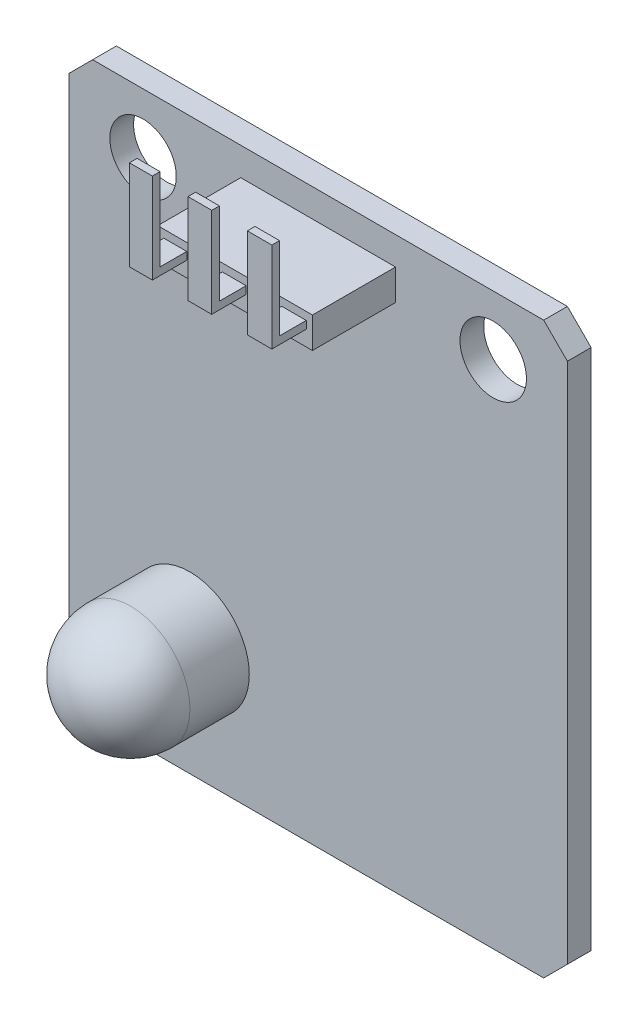
ISO-10303-21;
HEADER;
FILE_DESCRIPTION(('STEP AP214'),'2;1');
FILE_NAME('part.step','',(''),(''),'','','');
FILE_SCHEMA(('AUTOMOTIVE_DESIGN { 1 0 10303 214 1 1 1 1 }'));
ENDSEC;
DATA;
#1=APPLICATION_CONTEXT('core data for automotive mechanical design processes');
#2=APPLICATION_PROTOCOL_DEFINITION('international standard','automotive_design',2000,#1);
#3=PRODUCT_CONTEXT('',#1,'mechanical');
#4=PRODUCT('Part','Part','',(#3));
#5=PRODUCT_RELATED_PRODUCT_CATEGORY('part','',(#4));
#6=PRODUCT_DEFINITION_FORMATION('','',#4);
#7=PRODUCT_DEFINITION_CONTEXT('part definition',#1,'design');
#8=PRODUCT_DEFINITION('design','',#6,#7);
#9=PRODUCT_DEFINITION_SHAPE('','',#8);
#10=(LENGTH_UNIT() NAMED_UNIT(*) SI_UNIT(.MILLI.,.METRE.));
#11=(NAMED_UNIT(*) PLANE_ANGLE_UNIT() SI_UNIT($,.RADIAN.));
#12=(NAMED_UNIT(*) SI_UNIT($,.STERADIAN.) SOLID_ANGLE_UNIT());
#13=UNCERTAINTY_MEASURE_WITH_UNIT(LENGTH_MEASURE(1.E-05),#10,'distance_accuracy_value','');
#14=(GEOMETRIC_REPRESENTATION_CONTEXT(3) GLOBAL_UNCERTAINTY_ASSIGNED_CONTEXT((#13)) GLOBAL_UNIT_ASSIGNED_CONTEXT((#10,
#11,#12)) REPRESENTATION_CONTEXT('',''));
#15=CARTESIAN_POINT('',(0.,0.,0.));
#16=DIRECTION('',(0.,0.,1.));
#17=DIRECTION('',(1.,0.,0.));
#18=AXIS2_PLACEMENT_3D('',#15,#16,#17);
#19=CARTESIAN_POINT('',(-3.,10.1687371753627,5.94909617213709));
#20=DIRECTION('',(0.,-1.,0.));
#21=DIRECTION('',(0.,0.,-1.));
#22=AXIS2_PLACEMENT_3D('',#19,#20,#21);
#23=PLANE('',#22);
#24=DIRECTION('',(1.,0.,0.));
#25=VECTOR('',#24,1.);
#26=CARTESIAN_POINT('',(-3.,10.1687371753627,5.94909617213709));
#27=LINE('',#26,#25);
#28=CARTESIAN_POINT('',(1.96685444010033,10.1687371753627,5.94909617213709));
#29=VERTEX_POINT('',#28);
#30=CARTESIAN_POINT('',(3.,10.1687371753627,5.94909617213709));
#31=VERTEX_POINT('',#30);
#32=EDGE_CURVE('E267',#29,#31,#27,.T.);
#33=ORIENTED_EDGE('',*,*,#32,.F.);
#34=DIRECTION('',(0.,0.,-1.));
#35=VECTOR('',#34,1.);
#36=CARTESIAN_POINT('',(1.96685444010033,10.1687371753627,5.94909617213709));
#37=LINE('',#36,#35);
#38=CARTESIAN_POINT('',(1.96685444010033,10.1687371753627,4.5));
#39=VERTEX_POINT('',#38);
#40=EDGE_CURVE('E237',#29,#39,#37,.T.);
#41=ORIENTED_EDGE('',*,*,#40,.T.);
#42=DIRECTION('',(1.,0.,0.));
#43=VECTOR('',#42,1.);
#44=CARTESIAN_POINT('',(-3.,10.1687371753627,4.5));
#45=LINE('',#44,#43);
#46=CARTESIAN_POINT('',(3.,10.1687371753627,4.5));
#47=VERTEX_POINT('',#46);
#48=EDGE_CURVE('E276',#39,#47,#45,.T.);
#49=ORIENTED_EDGE('',*,*,#48,.T.);
#50=DIRECTION('',(0.,0.,-1.));
#51=VECTOR('',#50,1.);
#52=CARTESIAN_POINT('',(3.,10.1687371753627,5.94909617213709));
#53=LINE('',#52,#51);
#54=EDGE_CURVE('E437',#31,#47,#53,.T.);
#55=ORIENTED_EDGE('',*,*,#54,.F.);
#56=EDGE_LOOP('',(#33,#41,#49,#55));
#57=FACE_BOUND('',#56,.T.);
#58=ADVANCED_FACE('F35',(#57),#23,.T.);
#59=CARTESIAN_POINT('',(-0.533145559899668,10.1687371753627,4.5));
#60=VERTEX_POINT('',#59);
#61=CARTESIAN_POINT('',(0.466854440100332,10.1687371753627,4.5));
#62=VERTEX_POINT('',#61);
#63=EDGE_CURVE('E280',#60,#62,#45,.T.);
#64=ORIENTED_EDGE('',*,*,#63,.T.);
#65=DIRECTION('',(0.,0.,1.));
#66=VECTOR('',#65,1.);
#67=CARTESIAN_POINT('',(0.466854440100332,10.1687371753627,5.94909617213709));
#68=LINE('',#67,#66);
#69=CARTESIAN_POINT('',(0.466854440100332,10.1687371753627,5.94909617213709));
#70=VERTEX_POINT('',#69);
#71=EDGE_CURVE('E480',#62,#70,#68,.T.);
#72=ORIENTED_EDGE('',*,*,#71,.T.);
#73=CARTESIAN_POINT('',(-0.533145559899668,10.1687371753627,5.94909617213709));
#74=VERTEX_POINT('',#73);
#75=EDGE_CURVE('E271',#74,#70,#27,.T.);
#76=ORIENTED_EDGE('',*,*,#75,.F.);
#77=DIRECTION('',(0.,0.,-1.));
#78=VECTOR('',#77,1.);
#79=CARTESIAN_POINT('',(-0.533145559899668,10.1687371753627,5.94909617213709));
#80=LINE('',#79,#78);
#81=EDGE_CURVE('E452',#74,#60,#80,.T.);
#82=ORIENTED_EDGE('',*,*,#81,.T.);
#83=EDGE_LOOP('',(#64,#72,#76,#82));
#84=FACE_BOUND('',#83,.T.);
#85=ADVANCED_FACE('F520',(#84),#23,.T.);
#86=CARTESIAN_POINT('',(-3.,13.9643264333627,5.94909617213709));
#87=DIRECTION('',(0.,0.,1.));
#88=DIRECTION('',(1.,0.,0.));
#89=AXIS2_PLACEMENT_3D('',#86,#87,#88);
#90=PLANE('',#89);
#91=DIRECTION('',(1.,0.,0.));
#92=VECTOR('',#91,1.);
#93=CARTESIAN_POINT('',(-3.,13.9643264333627,5.94909617213709));
#94=LINE('',#93,#92);
#95=CARTESIAN_POINT('',(1.96685444010033,13.9643264333627,5.94909617213709));
#96=VERTEX_POINT('',#95);
#97=CARTESIAN_POINT('',(3.,13.9643264333627,5.94909617213709));
#98=VERTEX_POINT('',#97);
#99=EDGE_CURVE('E248',#96,#98,#94,.T.);
#100=ORIENTED_EDGE('',*,*,#99,.F.);
#101=DIRECTION('',(0.,-1.,0.));
#102=VECTOR('',#101,1.);
#103=CARTESIAN_POINT('',(1.96685444010033,13.9643264333627,5.94909617213709));
#104=LINE('',#103,#102);
#105=EDGE_CURVE('E231',#96,#29,#104,.T.);
#106=ORIENTED_EDGE('',*,*,#105,.T.);
#107=ORIENTED_EDGE('',*,*,#32,.T.);
#108=DIRECTION('',(0.,-1.,0.));
#109=VECTOR('',#108,1.);
#110=CARTESIAN_POINT('',(3.,13.9643264333627,5.94909617213709));
#111=LINE('',#110,#109);
#112=EDGE_CURVE('E256',#98,#31,#111,.T.);
#113=ORIENTED_EDGE('',*,*,#112,.F.);
#114=EDGE_LOOP('',(#100,#106,#107,#113));
#115=FACE_BOUND('',#114,.T.);
#116=ADVANCED_FACE('F254',(#115),#90,.T.);
#117=ORIENTED_EDGE('',*,*,#75,.T.);
#118=DIRECTION('',(0.,-1.,0.));
#119=VECTOR('',#118,1.);
#120=CARTESIAN_POINT('',(0.466854440100332,13.9643264333627,5.94909617213709));
#121=LINE('',#120,#119);
#122=CARTESIAN_POINT('',(0.466854440100332,13.9643264333627,5.94909617213709));
#123=VERTEX_POINT('',#122);
#124=EDGE_CURVE('E489',#123,#70,#121,.T.);
#125=ORIENTED_EDGE('',*,*,#124,.F.);
#126=CARTESIAN_POINT('',(-0.533145559899668,13.9643264333627,5.94909617213709));
#127=VERTEX_POINT('',#126);
#128=EDGE_CURVE('E257',#127,#123,#94,.T.);
#129=ORIENTED_EDGE('',*,*,#128,.F.);
#130=DIRECTION('',(0.,-1.,0.));
#131=VECTOR('',#130,1.);
#132=CARTESIAN_POINT('',(-0.533145559899668,13.9643264333627,5.94909617213709));
#133=LINE('',#132,#131);
#134=EDGE_CURVE('E462',#127,#74,#133,.T.);
#135=ORIENTED_EDGE('',*,*,#134,.T.);
#136=EDGE_LOOP('',(#117,#125,#129,#135));
#137=FACE_BOUND('',#136,.T.);
#138=ADVANCED_FACE('F499',(#137),#90,.T.);
#139=CARTESIAN_POINT('',(-3.,13.9643264333627,5.62663297471996));
#140=DIRECTION('',(0.,1.,0.));
#141=DIRECTION('',(0.,0.,1.));
#142=AXIS2_PLACEMENT_3D('',#139,#140,#141);
#143=PLANE('',#142);
#144=DIRECTION('',(1.,0.,0.));
#145=VECTOR('',#144,1.);
#146=CARTESIAN_POINT('',(-3.,13.9643264333627,5.62663297471996));
#147=LINE('',#146,#145);
#148=CARTESIAN_POINT('',(1.96685444010033,13.9643264333627,5.62663297471996));
#149=VERTEX_POINT('',#148);
#150=CARTESIAN_POINT('',(3.,13.9643264333627,5.62663297471996));
#151=VERTEX_POINT('',#150);
#152=EDGE_CURVE('E250',#149,#151,#147,.T.);
#153=ORIENTED_EDGE('',*,*,#152,.F.);
#154=DIRECTION('',(0.,0.,-1.));
#155=VECTOR('',#154,1.);
#156=CARTESIAN_POINT('',(1.96685444010033,13.9643264333627,4.5));
#157=LINE('',#156,#155);
#158=EDGE_CURVE('E234',#96,#149,#157,.T.);
#159=ORIENTED_EDGE('',*,*,#158,.F.);
#160=ORIENTED_EDGE('',*,*,#99,.T.);
#161=DIRECTION('',(0.,0.,1.));
#162=VECTOR('',#161,1.);
#163=CARTESIAN_POINT('',(3.,13.9643264333627,5.62663297471996));
#164=LINE('',#163,#162);
#165=EDGE_CURVE('E441',#151,#98,#164,.T.);
#166=ORIENTED_EDGE('',*,*,#165,.F.);
#167=EDGE_LOOP('',(#153,#159,#160,#166));
#168=FACE_BOUND('',#167,.T.);
#169=ADVANCED_FACE('F246',(#168),#143,.T.);
#170=ORIENTED_EDGE('',*,*,#128,.T.);
#171=DIRECTION('',(0.,0.,1.));
#172=VECTOR('',#171,1.);
#173=CARTESIAN_POINT('',(0.466854440100332,13.9643264333627,5.94909617213709));
#174=LINE('',#173,#172);
#175=CARTESIAN_POINT('',(0.466854440100332,13.9643264333627,5.62663297471996));
#176=VERTEX_POINT('',#175);
#177=EDGE_CURVE('E251',#176,#123,#174,.T.);
#178=ORIENTED_EDGE('',*,*,#177,.F.);
#179=CARTESIAN_POINT('',(-0.533145559899668,13.9643264333627,5.62663297471996));
#180=VERTEX_POINT('',#179);
#181=EDGE_CURVE('E263',#180,#176,#147,.T.);
#182=ORIENTED_EDGE('',*,*,#181,.F.);
#183=DIRECTION('',(0.,0.,-1.));
#184=VECTOR('',#183,1.);
#185=CARTESIAN_POINT('',(-0.533145559899668,13.9643264333627,4.5));
#186=LINE('',#185,#184);
#187=EDGE_CURVE('E472',#127,#180,#186,.T.);
#188=ORIENTED_EDGE('',*,*,#187,.F.);
#189=EDGE_LOOP('',(#170,#178,#182,#188));
#190=FACE_BOUND('',#189,.T.);
#191=ADVANCED_FACE('F502',(#190),#143,.T.);
#192=CARTESIAN_POINT('',(-3.,10.4888897500892,5.62663297471996));
#193=DIRECTION('',(0.,0.,-1.));
#194=DIRECTION('',(-1.,0.,0.));
#195=AXIS2_PLACEMENT_3D('',#192,#193,#194);
#196=PLANE('',#195);
#197=DIRECTION('',(1.,0.,0.));
#198=VECTOR('',#197,1.);
#199=CARTESIAN_POINT('',(-3.,10.4888897500892,5.62663297471996));
#200=LINE('',#199,#198);
#201=CARTESIAN_POINT('',(1.96685444010033,10.4888897500892,5.62663297471996));
#202=VERTEX_POINT('',#201);
#203=CARTESIAN_POINT('',(3.,10.4888897500892,5.62663297471996));
#204=VERTEX_POINT('',#203);
#205=EDGE_CURVE('E412',#202,#204,#200,.T.);
#206=ORIENTED_EDGE('',*,*,#205,.F.);
#207=DIRECTION('',(0.,1.,0.));
#208=VECTOR('',#207,1.);
#209=CARTESIAN_POINT('',(1.96685444010033,10.4888897500892,5.62663297471996));
#210=LINE('',#209,#208);
#211=EDGE_CURVE('E475',#202,#149,#210,.T.);
#212=ORIENTED_EDGE('',*,*,#211,.T.);
#213=ORIENTED_EDGE('',*,*,#152,.T.);
#214=DIRECTION('',(0.,1.,0.));
#215=VECTOR('',#214,1.);
#216=CARTESIAN_POINT('',(3.,10.4888897500892,5.62663297471996));
#217=LINE('',#216,#215);
#218=EDGE_CURVE('E443',#204,#151,#217,.T.);
#219=ORIENTED_EDGE('',*,*,#218,.F.);
#220=EDGE_LOOP('',(#206,#212,#213,#219));
#221=FACE_BOUND('',#220,.T.);
#222=ADVANCED_FACE('F513',(#221),#196,.T.);
#223=ORIENTED_EDGE('',*,*,#181,.T.);
#224=DIRECTION('',(0.,-1.,0.));
#225=VECTOR('',#224,1.);
#226=CARTESIAN_POINT('',(0.466854440100332,10.4888897500892,5.62663297471996));
#227=LINE('',#226,#225);
#228=CARTESIAN_POINT('',(0.466854440100332,10.4888897500892,5.62663297471996));
#229=VERTEX_POINT('',#228);
#230=EDGE_CURVE('E483',#176,#229,#227,.T.);
#231=ORIENTED_EDGE('',*,*,#230,.T.);
#232=CARTESIAN_POINT('',(-0.533145559899668,10.4888897500892,5.62663297471996));
#233=VERTEX_POINT('',#232);
#234=EDGE_CURVE('E416',#233,#229,#200,.T.);
#235=ORIENTED_EDGE('',*,*,#234,.F.);
#236=DIRECTION('',(0.,1.,0.));
#237=VECTOR('',#236,1.);
#238=CARTESIAN_POINT('',(-0.533145559899668,10.4888897500892,5.62663297471996));
#239=LINE('',#238,#237);
#240=EDGE_CURVE('E455',#233,#180,#239,.T.);
#241=ORIENTED_EDGE('',*,*,#240,.T.);
#242=EDGE_LOOP('',(#223,#231,#235,#241));
#243=FACE_BOUND('',#242,.T.);
#244=ADVANCED_FACE('F507',(#243),#196,.T.);
#245=CARTESIAN_POINT('',(-3.,10.4888897500892,4.5));
#246=DIRECTION('',(0.,1.,0.));
#247=DIRECTION('',(0.,0.,1.));
#248=AXIS2_PLACEMENT_3D('',#245,#246,#247);
#249=PLANE('',#248);
#250=DIRECTION('',(1.,0.,0.));
#251=VECTOR('',#250,1.);
#252=CARTESIAN_POINT('',(-3.,10.4888897500892,4.5));
#253=LINE('',#252,#251);
#254=CARTESIAN_POINT('',(1.96685444010033,10.4888897500892,4.5));
#255=VERTEX_POINT('',#254);
#256=CARTESIAN_POINT('',(3.,10.4888897500892,4.5));
#257=VERTEX_POINT('',#256);
#258=EDGE_CURVE('E415',#255,#257,#253,.T.);
#259=ORIENTED_EDGE('',*,*,#258,.F.);
#260=DIRECTION('',(0.,0.,1.));
#261=VECTOR('',#260,1.);
#262=CARTESIAN_POINT('',(1.96685444010033,10.4888897500892,4.5));
#263=LINE('',#262,#261);
#264=EDGE_CURVE('E477',#255,#202,#263,.T.);
#265=ORIENTED_EDGE('',*,*,#264,.T.);
#266=ORIENTED_EDGE('',*,*,#205,.T.);
#267=DIRECTION('',(0.,0.,1.));
#268=VECTOR('',#267,1.);
#269=CARTESIAN_POINT('',(3.,10.4888897500892,4.5));
#270=LINE('',#269,#268);
#271=EDGE_CURVE('E446',#257,#204,#270,.T.);
#272=ORIENTED_EDGE('',*,*,#271,.F.);
#273=EDGE_LOOP('',(#259,#265,#266,#272));
#274=FACE_BOUND('',#273,.T.);
#275=ADVANCED_FACE('F517',(#274),#249,.T.);
#276=ORIENTED_EDGE('',*,*,#234,.T.);
#277=DIRECTION('',(0.,0.,-1.));
#278=VECTOR('',#277,1.);
#279=CARTESIAN_POINT('',(0.466854440100332,10.4888897500892,4.5));
#280=LINE('',#279,#278);
#281=CARTESIAN_POINT('',(0.466854440100332,10.4888897500892,4.5));
#282=VERTEX_POINT('',#281);
#283=EDGE_CURVE('E241',#229,#282,#280,.T.);
#284=ORIENTED_EDGE('',*,*,#283,.T.);
#285=CARTESIAN_POINT('',(-0.533145559899668,10.4888897500892,4.5));
#286=VERTEX_POINT('',#285);
#287=EDGE_CURVE('E413',#286,#282,#253,.T.);
#288=ORIENTED_EDGE('',*,*,#287,.F.);
#289=DIRECTION('',(0.,0.,1.));
#290=VECTOR('',#289,1.);
#291=CARTESIAN_POINT('',(-0.533145559899668,10.4888897500892,4.5));
#292=LINE('',#291,#290);
#293=EDGE_CURVE('E11',#286,#233,#292,.T.);
#294=ORIENTED_EDGE('',*,*,#293,.T.);
#295=EDGE_LOOP('',(#276,#284,#288,#294));
#296=FACE_BOUND('',#295,.T.);
#297=ADVANCED_FACE('F532',(#296),#249,.T.);
#298=CARTESIAN_POINT('',(-3.,10.1687371753627,4.5));
#299=VERTEX_POINT('',#298);
#300=CARTESIAN_POINT('',(-2.03314555989967,10.1687371753627,4.5));
#301=VERTEX_POINT('',#300);
#302=EDGE_CURVE('E281',#299,#301,#45,.T.);
#303=ORIENTED_EDGE('',*,*,#302,.T.);
#304=DIRECTION('',(0.,0.,1.));
#305=VECTOR('',#304,1.);
#306=CARTESIAN_POINT('',(-2.03314555989967,10.1687371753627,5.94909617213709));
#307=LINE('',#306,#305);
#308=CARTESIAN_POINT('',(-2.03314555989967,10.1687371753627,5.94909617213709));
#309=VERTEX_POINT('',#308);
#310=EDGE_CURVE('E458',#301,#309,#307,.T.);
#311=ORIENTED_EDGE('',*,*,#310,.T.);
#312=CARTESIAN_POINT('',(-3.,10.1687371753627,5.94909617213709));
#313=VERTEX_POINT('',#312);
#314=EDGE_CURVE('E272',#313,#309,#27,.T.);
#315=ORIENTED_EDGE('',*,*,#314,.F.);
#316=DIRECTION('',(0.,0.,-1.));
#317=VECTOR('',#316,1.);
#318=CARTESIAN_POINT('',(-3.,10.1687371753627,5.94909617213709));
#319=LINE('',#318,#317);
#320=EDGE_CURVE('E420',#313,#299,#319,.T.);
#321=ORIENTED_EDGE('',*,*,#320,.T.);
#322=EDGE_LOOP('',(#303,#311,#315,#321));
#323=FACE_BOUND('',#322,.T.);
#324=ADVANCED_FACE('F522',(#323),#23,.T.);
#325=ORIENTED_EDGE('',*,*,#314,.T.);
#326=DIRECTION('',(0.,-1.,0.));
#327=VECTOR('',#326,1.);
#328=CARTESIAN_POINT('',(-2.03314555989967,13.9643264333627,5.94909617213709));
#329=LINE('',#328,#327);
#330=CARTESIAN_POINT('',(-2.03314555989967,13.9643264333627,5.94909617213709));
#331=VERTEX_POINT('',#330);
#332=EDGE_CURVE('E468',#331,#309,#329,.T.);
#333=ORIENTED_EDGE('',*,*,#332,.F.);
#334=CARTESIAN_POINT('',(-3.,13.9643264333627,5.94909617213709));
#335=VERTEX_POINT('',#334);
#336=EDGE_CURVE('E260',#335,#331,#94,.T.);
#337=ORIENTED_EDGE('',*,*,#336,.F.);
#338=DIRECTION('',(0.,-1.,0.));
#339=VECTOR('',#338,1.);
#340=CARTESIAN_POINT('',(-3.,13.9643264333627,5.94909617213709));
#341=LINE('',#340,#339);
#342=EDGE_CURVE('E425',#335,#313,#341,.T.);
#343=ORIENTED_EDGE('',*,*,#342,.T.);
#344=EDGE_LOOP('',(#325,#333,#337,#343));
#345=FACE_BOUND('',#344,.T.);
#346=ADVANCED_FACE('F531',(#345),#90,.T.);
#347=ORIENTED_EDGE('',*,*,#336,.T.);
#348=DIRECTION('',(0.,0.,1.));
#349=VECTOR('',#348,1.);
#350=CARTESIAN_POINT('',(-2.03314555989967,13.9643264333627,5.94909617213709));
#351=LINE('',#350,#349);
#352=CARTESIAN_POINT('',(-2.03314555989967,13.9643264333627,5.62663297471996));
#353=VERTEX_POINT('',#352);
#354=EDGE_CURVE('E470',#353,#331,#351,.T.);
#355=ORIENTED_EDGE('',*,*,#354,.F.);
#356=CARTESIAN_POINT('',(-3.,13.9643264333627,5.62663297471996));
#357=VERTEX_POINT('',#356);
#358=EDGE_CURVE('E258',#357,#353,#147,.T.);
#359=ORIENTED_EDGE('',*,*,#358,.F.);
#360=DIRECTION('',(0.,0.,1.));
#361=VECTOR('',#360,1.);
#362=CARTESIAN_POINT('',(-3.,13.9643264333627,5.62663297471996));
#363=LINE('',#362,#361);
#364=EDGE_CURVE('E427',#357,#335,#363,.T.);
#365=ORIENTED_EDGE('',*,*,#364,.T.);
#366=EDGE_LOOP('',(#347,#355,#359,#365));
#367=FACE_BOUND('',#366,.T.);
#368=ADVANCED_FACE('F537',(#367),#143,.T.);
#369=ORIENTED_EDGE('',*,*,#358,.T.);
#370=DIRECTION('',(0.,-1.,0.));
#371=VECTOR('',#370,1.);
#372=CARTESIAN_POINT('',(-2.03314555989967,10.4888897500892,5.62663297471996));
#373=LINE('',#372,#371);
#374=CARTESIAN_POINT('',(-2.03314555989967,10.4888897500892,5.62663297471996));
#375=VERTEX_POINT('',#374);
#376=EDGE_CURVE('E460',#353,#375,#373,.T.);
#377=ORIENTED_EDGE('',*,*,#376,.T.);
#378=CARTESIAN_POINT('',(-3.,10.4888897500892,5.62663297471996));
#379=VERTEX_POINT('',#378);
#380=EDGE_CURVE('E406',#379,#375,#200,.T.);
#381=ORIENTED_EDGE('',*,*,#380,.F.);
#382=DIRECTION('',(0.,1.,0.));
#383=VECTOR('',#382,1.);
#384=CARTESIAN_POINT('',(-3.,10.4888897500892,5.62663297471996));
#385=LINE('',#384,#383);
#386=EDGE_CURVE('E431',#379,#357,#385,.T.);
#387=ORIENTED_EDGE('',*,*,#386,.T.);
#388=EDGE_LOOP('',(#369,#377,#381,#387));
#389=FACE_BOUND('',#388,.T.);
#390=ADVANCED_FACE('F545',(#389),#196,.T.);
#391=ORIENTED_EDGE('',*,*,#380,.T.);
#392=DIRECTION('',(0.,0.,-1.));
#393=VECTOR('',#392,1.);
#394=CARTESIAN_POINT('',(-2.03314555989967,10.4888897500892,4.5));
#395=LINE('',#394,#393);
#396=CARTESIAN_POINT('',(-2.03314555989967,10.4888897500892,4.5));
#397=VERTEX_POINT('',#396);
#398=EDGE_CURVE('E43',#375,#397,#395,.T.);
#399=ORIENTED_EDGE('',*,*,#398,.T.);
#400=CARTESIAN_POINT('',(-3.,10.4888897500892,4.5));
#401=VERTEX_POINT('',#400);
#402=EDGE_CURVE('E404',#401,#397,#253,.T.);
#403=ORIENTED_EDGE('',*,*,#402,.F.);
#404=DIRECTION('',(0.,0.,1.));
#405=VECTOR('',#404,1.);
#406=CARTESIAN_POINT('',(-3.,10.4888897500892,4.5));
#407=LINE('',#406,#405);
#408=EDGE_CURVE('E434',#401,#379,#407,.T.);
#409=ORIENTED_EDGE('',*,*,#408,.T.);
#410=EDGE_LOOP('',(#391,#399,#403,#409));
#411=FACE_BOUND('',#410,.T.);
#412=ADVANCED_FACE('F402',(#411),#249,.T.);
#413=CARTESIAN_POINT('',(0.,0.,4.5));
#414=DIRECTION('',(0.,0.,1.));
#415=DIRECTION('',(1.,0.,0.));
#416=AXIS2_PLACEMENT_3D('',#413,#414,#415);
#417=PLANE('',#416);
#418=DIRECTION('',(0.,-1.,0.));
#419=VECTOR('',#418,1.);
#420=CARTESIAN_POINT('',(0.466854440100332,13.9643264333627,4.5));
#421=LINE('',#420,#419);
#422=EDGE_CURVE('E50',#282,#62,#421,.T.);
#423=ORIENTED_EDGE('',*,*,#422,.T.);
#424=ORIENTED_EDGE('',*,*,#63,.F.);
#425=DIRECTION('',(0.,-1.,0.));
#426=VECTOR('',#425,1.);
#427=CARTESIAN_POINT('',(-0.533145559899668,13.9643264333627,4.5));
#428=LINE('',#427,#426);
#429=EDGE_CURVE('E465',#286,#60,#428,.T.);
#430=ORIENTED_EDGE('',*,*,#429,.F.);
#431=ORIENTED_EDGE('',*,*,#287,.T.);
#432=EDGE_LOOP('',(#423,#424,#430,#431));
#433=FACE_BOUND('',#432,.T.);
#434=ORIENTED_EDGE('',*,*,#48,.F.);
#435=DIRECTION('',(0.,-1.,0.));
#436=VECTOR('',#435,1.);
#437=CARTESIAN_POINT('',(1.96685444010033,13.9643264333627,4.5));
#438=LINE('',#437,#436);
#439=EDGE_CURVE('E242',#255,#39,#438,.T.);
#440=ORIENTED_EDGE('',*,*,#439,.F.);
#441=ORIENTED_EDGE('',*,*,#258,.T.);
#442=DIRECTION('',(0.,1.,0.));
#443=VECTOR('',#442,1.);
#444=CARTESIAN_POINT('',(3.,10.4888897500892,4.5));
#445=LINE('',#444,#443);
#446=EDGE_CURVE('E449',#47,#257,#445,.T.);
#447=ORIENTED_EDGE('',*,*,#446,.F.);
#448=EDGE_LOOP('',(#434,#440,#441,#447));
#449=FACE_BOUND('',#448,.T.);
#450=DIRECTION('',(1.,0.,0.));
#451=VECTOR('',#450,1.);
#452=CARTESIAN_POINT('',(-3.25939398415699,9.52065377420153,4.5));
#453=LINE('',#452,#451);
#454=CARTESIAN_POINT('',(-3.25939398415699,9.52065377420153,4.5));
#455=VERTEX_POINT('',#454);
#456=CARTESIAN_POINT('',(3.25939398415699,9.52065377420153,4.5));
#457=VERTEX_POINT('',#456);
#458=EDGE_CURVE('E304',#455,#457,#453,.T.);
#459=ORIENTED_EDGE('',*,*,#458,.T.);
#460=DIRECTION('',(0.,1.,0.));
#461=VECTOR('',#460,1.);
#462=CARTESIAN_POINT('',(3.25939398415699,10.8168205765239,4.5));
#463=LINE('',#462,#461);
#464=CARTESIAN_POINT('',(3.25939398415699,10.8168205765239,4.5));
#465=VERTEX_POINT('',#464);
#466=EDGE_CURVE('E311',#457,#465,#463,.T.);
#467=ORIENTED_EDGE('',*,*,#466,.T.);
#468=DIRECTION('',(-1.,0.,0.));
#469=VECTOR('',#468,1.);
#470=CARTESIAN_POINT('',(-3.25939398415699,10.8168205765239,4.5));
#471=LINE('',#470,#469);
#472=CARTESIAN_POINT('',(-3.25939398415699,10.8168205765239,4.5));
#473=VERTEX_POINT('',#472);
#474=EDGE_CURVE('E910',#465,#473,#471,.T.);
#475=ORIENTED_EDGE('',*,*,#474,.T.);
#476=DIRECTION('',(0.,-1.,0.));
#477=VECTOR('',#476,1.);
#478=CARTESIAN_POINT('',(-3.25939398415699,10.8168205765239,4.5));
#479=LINE('',#478,#477);
#480=EDGE_CURVE('E908',#473,#455,#479,.T.);
#481=ORIENTED_EDGE('',*,*,#480,.T.);
#482=EDGE_LOOP('',(#459,#467,#475,#481));
#483=FACE_BOUND('',#482,.T.);
#484=DIRECTION('',(0.,-1.,0.));
#485=VECTOR('',#484,1.);
#486=CARTESIAN_POINT('',(-2.03314555989967,13.9643264333627,4.5));
#487=LINE('',#486,#485);
#488=EDGE_CURVE('E58',#397,#301,#487,.T.);
#489=ORIENTED_EDGE('',*,*,#488,.T.);
#490=ORIENTED_EDGE('',*,*,#302,.F.);
#491=DIRECTION('',(0.,1.,0.));
#492=VECTOR('',#491,1.);
#493=CARTESIAN_POINT('',(-3.,10.4888897500892,4.5));
#494=LINE('',#493,#492);
#495=EDGE_CURVE('E411',#299,#401,#494,.T.);
#496=ORIENTED_EDGE('',*,*,#495,.T.);
#497=ORIENTED_EDGE('',*,*,#402,.T.);
#498=EDGE_LOOP('',(#489,#490,#496,#497));
#499=FACE_BOUND('',#498,.T.);
#500=ADVANCED_FACE('F409',(#433,#449,#483,#499),#417,.T.);
#501=CARTESIAN_POINT('',(0.,0.,1.));
#502=DIRECTION('',(0.,0.,1.));
#503=DIRECTION('',(1.,0.,0.));
#504=AXIS2_PLACEMENT_3D('',#501,#502,#503);
#505=PLANE('',#504);
#506=CARTESIAN_POINT('',(-5.40083093394962,-7.13462040990503,1.));
#507=DIRECTION('',(0.,0.,1.));
#508=DIRECTION('',(1.,0.,0.));
#509=AXIS2_PLACEMENT_3D('',#506,#507,#508);
#510=CIRCLE('',#509,2.5);
#511=CARTESIAN_POINT('',(-2.90083093394962,-7.13462040990503,1.));
#512=VERTEX_POINT('',#511);
#513=EDGE_CURVE('E321',#512,#512,#510,.T.);
#514=ORIENTED_EDGE('',*,*,#513,.F.);
#515=EDGE_LOOP('',(#514));
#516=FACE_BOUND('',#515,.T.);
#517=CARTESIAN_POINT('',(-7.375,9.5,1.));
#518=DIRECTION('',(0.,0.,1.));
#519=DIRECTION('',(-1.,0.,0.));
#520=AXIS2_PLACEMENT_3D('',#517,#518,#519);
#521=CIRCLE('',#520,1.4);
#522=CARTESIAN_POINT('',(-8.775,9.5,1.));
#523=VERTEX_POINT('',#522);
#524=EDGE_CURVE('E324',#523,#523,#521,.T.);
#525=ORIENTED_EDGE('',*,*,#524,.F.);
#526=EDGE_LOOP('',(#525));
#527=FACE_BOUND('',#526,.T.);
#528=CARTESIAN_POINT('',(7.375,9.5,1.));
#529=DIRECTION('',(0.,0.,1.));
#530=DIRECTION('',(1.,0.,0.));
#531=AXIS2_PLACEMENT_3D('',#528,#529,#530);
#532=CIRCLE('',#531,1.4);
#533=CARTESIAN_POINT('',(8.775,9.5,1.));
#534=VERTEX_POINT('',#533);
#535=EDGE_CURVE('E328',#534,#534,#532,.T.);
#536=ORIENTED_EDGE('',*,*,#535,.F.);
#537=EDGE_LOOP('',(#536));
#538=FACE_BOUND('',#537,.T.);
#539=DIRECTION('',(-1.,0.,0.));
#540=VECTOR('',#539,1.);
#541=CARTESIAN_POINT('',(-10.5,12.,1.));
#542=LINE('',#541,#540);
#543=CARTESIAN_POINT('',(9.49999999999999,12.,1.));
#544=VERTEX_POINT('',#543);
#545=CARTESIAN_POINT('',(-9.5,12.,1.));
#546=VERTEX_POINT('',#545);
#547=EDGE_CURVE('E340',#544,#546,#542,.T.);
#548=ORIENTED_EDGE('',*,*,#547,.T.);
#549=DIRECTION('',(0.707106781186549,0.707106781186546,0.));
#550=VECTOR('',#549,1.);
#551=CARTESIAN_POINT('',(-10.75,10.75,1.));
#552=LINE('',#551,#550);
#553=CARTESIAN_POINT('',(-10.5,11.,1.));
#554=VERTEX_POINT('',#553);
#555=EDGE_CURVE('E384',#546,#554,#552,.F.);
#556=ORIENTED_EDGE('',*,*,#555,.T.);
#557=DIRECTION('',(0.,-1.,0.));
#558=VECTOR('',#557,1.);
#559=CARTESIAN_POINT('',(-10.5,12.,1.));
#560=LINE('',#559,#558);
#561=CARTESIAN_POINT('',(-10.5,-11.,1.));
#562=VERTEX_POINT('',#561);
#563=EDGE_CURVE('E344',#554,#562,#560,.T.);
#564=ORIENTED_EDGE('',*,*,#563,.T.);
#565=DIRECTION('',(-0.707106781186546,0.707106781186549,0.));
#566=VECTOR('',#565,1.);
#567=CARTESIAN_POINT('',(-10.75,-10.75,1.));
#568=LINE('',#567,#566);
#569=CARTESIAN_POINT('',(-9.5,-12.,1.));
#570=VERTEX_POINT('',#569);
#571=EDGE_CURVE('E380',#562,#570,#568,.F.);
#572=ORIENTED_EDGE('',*,*,#571,.T.);
#573=DIRECTION('',(1.,0.,0.));
#574=VECTOR('',#573,1.);
#575=CARTESIAN_POINT('',(-10.5,-12.,1.));
#576=LINE('',#575,#574);
#577=CARTESIAN_POINT('',(9.5,-12.,1.));
#578=VERTEX_POINT('',#577);
#579=EDGE_CURVE('E347',#570,#578,#576,.T.);
#580=ORIENTED_EDGE('',*,*,#579,.T.);
#581=DIRECTION('',(-0.707106781186548,-0.707106781186547,0.));
#582=VECTOR('',#581,1.);
#583=CARTESIAN_POINT('',(10.75,-10.75,1.));
#584=LINE('',#583,#582);
#585=CARTESIAN_POINT('',(10.5,-11.,1.));
#586=VERTEX_POINT('',#585);
#587=EDGE_CURVE('E382',#578,#586,#584,.F.);
#588=ORIENTED_EDGE('',*,*,#587,.T.);
#589=DIRECTION('',(0.,1.,0.));
#590=VECTOR('',#589,1.);
#591=CARTESIAN_POINT('',(10.5,12.,1.));
#592=LINE('',#591,#590);
#593=CARTESIAN_POINT('',(10.5,11.,1.));
#594=VERTEX_POINT('',#593);
#595=EDGE_CURVE('E337',#586,#594,#592,.T.);
#596=ORIENTED_EDGE('',*,*,#595,.T.);
#597=DIRECTION('',(0.707106781186546,-0.707106781186549,0.));
#598=VECTOR('',#597,1.);
#599=CARTESIAN_POINT('',(10.75,10.75,1.));
#600=LINE('',#599,#598);
#601=EDGE_CURVE('E378',#594,#544,#600,.F.);
#602=ORIENTED_EDGE('',*,*,#601,.T.);
#603=EDGE_LOOP('',(#548,#556,#564,#572,#580,#588,#596,#602));
#604=FACE_BOUND('',#603,.T.);
#605=DIRECTION('',(-1.,0.,0.));
#606=VECTOR('',#605,1.);
#607=CARTESIAN_POINT('',(-3.25939398415699,10.8168205765239,1.));
#608=LINE('',#607,#606);
#609=CARTESIAN_POINT('',(3.25939398415699,10.8168205765239,1.));
#610=VERTEX_POINT('',#609);
#611=CARTESIAN_POINT('',(-3.25939398415699,10.8168205765239,1.));
#612=VERTEX_POINT('',#611);
#613=EDGE_CURVE('E294',#610,#612,#608,.T.);
#614=ORIENTED_EDGE('',*,*,#613,.F.);
#615=DIRECTION('',(0.,1.,0.));
#616=VECTOR('',#615,1.);
#617=CARTESIAN_POINT('',(3.25939398415699,10.8168205765239,1.));
#618=LINE('',#617,#616);
#619=CARTESIAN_POINT('',(3.25939398415699,9.52065377420153,1.));
#620=VERTEX_POINT('',#619);
#621=EDGE_CURVE('E289',#620,#610,#618,.T.);
#622=ORIENTED_EDGE('',*,*,#621,.F.);
#623=DIRECTION('',(1.,0.,0.));
#624=VECTOR('',#623,1.);
#625=CARTESIAN_POINT('',(-3.25939398415699,9.52065377420153,1.));
#626=LINE('',#625,#624);
#627=CARTESIAN_POINT('',(-3.25939398415699,9.52065377420153,1.));
#628=VERTEX_POINT('',#627);
#629=EDGE_CURVE('E309',#628,#620,#626,.T.);
#630=ORIENTED_EDGE('',*,*,#629,.F.);
#631=DIRECTION('',(0.,-1.,0.));
#632=VECTOR('',#631,1.);
#633=CARTESIAN_POINT('',(-3.25939398415699,10.8168205765239,1.));
#634=LINE('',#633,#632);
#635=EDGE_CURVE('E301',#612,#628,#634,.T.);
#636=ORIENTED_EDGE('',*,*,#635,.F.);
#637=EDGE_LOOP('',(#614,#622,#630,#636));
#638=FACE_BOUND('',#637,.T.);
#639=ADVANCED_FACE('F550',(#516,#527,#538,#604,#638),#505,.T.);
#640=CARTESIAN_POINT('',(10.5,12.,1.));
#641=DIRECTION('',(-1.,0.,0.));
#642=DIRECTION('',(0.,-1.,0.));
#643=AXIS2_PLACEMENT_3D('',#640,#641,#642);
#644=PLANE('',#643);
#645=ORIENTED_EDGE('',*,*,#595,.F.);
#646=DIRECTION('',(0.,0.,-1.));
#647=VECTOR('',#646,1.);
#648=CARTESIAN_POINT('',(10.5,-11.,1.));
#649=LINE('',#648,#647);
#650=CARTESIAN_POINT('',(10.5,-11.,0.));
#651=VERTEX_POINT('',#650);
#652=EDGE_CURVE('E388',#586,#651,#649,.T.);
#653=ORIENTED_EDGE('',*,*,#652,.T.);
#654=DIRECTION('',(0.,1.,0.));
#655=VECTOR('',#654,1.);
#656=CARTESIAN_POINT('',(10.5,12.,0.));
#657=LINE('',#656,#655);
#658=CARTESIAN_POINT('',(10.5,11.,0.));
#659=VERTEX_POINT('',#658);
#660=EDGE_CURVE('E334',#651,#659,#657,.T.);
#661=ORIENTED_EDGE('',*,*,#660,.T.);
#662=DIRECTION('',(0.,0.,1.));
#663=VECTOR('',#662,1.);
#664=CARTESIAN_POINT('',(10.5,11.,1.));
#665=LINE('',#664,#663);
#666=EDGE_CURVE('E386',#659,#594,#665,.T.);
#667=ORIENTED_EDGE('',*,*,#666,.T.);
#668=EDGE_LOOP('',(#645,#653,#661,#667));
#669=FACE_BOUND('',#668,.T.);
#670=ADVANCED_FACE('F750',(#669),#644,.F.);
#671=CARTESIAN_POINT('',(-10.5,12.,1.));
#672=DIRECTION('',(0.,-1.,0.));
#673=DIRECTION('',(0.,0.,-1.));
#674=AXIS2_PLACEMENT_3D('',#671,#672,#673);
#675=PLANE('',#674);
#676=DIRECTION('',(-1.,0.,0.));
#677=VECTOR('',#676,1.);
#678=CARTESIAN_POINT('',(-10.5,12.,0.));
#679=LINE('',#678,#677);
#680=CARTESIAN_POINT('',(9.49999999999999,12.,0.));
#681=VERTEX_POINT('',#680);
#682=CARTESIAN_POINT('',(-9.5,12.,0.));
#683=VERTEX_POINT('',#682);
#684=EDGE_CURVE('E353',#681,#683,#679,.T.);
#685=ORIENTED_EDGE('',*,*,#684,.T.);
#686=DIRECTION('',(0.,0.,1.));
#687=VECTOR('',#686,1.);
#688=CARTESIAN_POINT('',(-9.5,12.,1.));
#689=LINE('',#688,#687);
#690=EDGE_CURVE('E376',#683,#546,#689,.T.);
#691=ORIENTED_EDGE('',*,*,#690,.T.);
#692=ORIENTED_EDGE('',*,*,#547,.F.);
#693=DIRECTION('',(0.,0.,-1.));
#694=VECTOR('',#693,1.);
#695=CARTESIAN_POINT('',(9.5,12.,1.));
#696=LINE('',#695,#694);
#697=EDGE_CURVE('E373',#544,#681,#696,.T.);
#698=ORIENTED_EDGE('',*,*,#697,.T.);
#699=EDGE_LOOP('',(#685,#691,#692,#698));
#700=FACE_BOUND('',#699,.T.);
#701=ADVANCED_FACE('F849',(#700),#675,.F.);
#702=CARTESIAN_POINT('',(-10.5,12.,1.));
#703=DIRECTION('',(1.,0.,0.));
#704=DIRECTION('',(0.,1.,0.));
#705=AXIS2_PLACEMENT_3D('',#702,#703,#704);
#706=PLANE('',#705);
#707=ORIENTED_EDGE('',*,*,#563,.F.);
#708=DIRECTION('',(0.,0.,-1.));
#709=VECTOR('',#708,1.);
#710=CARTESIAN_POINT('',(-10.5,11.,1.));
#711=LINE('',#710,#709);
#712=CARTESIAN_POINT('',(-10.5,11.,0.));
#713=VERTEX_POINT('',#712);
#714=EDGE_CURVE('E362',#554,#713,#711,.T.);
#715=ORIENTED_EDGE('',*,*,#714,.T.);
#716=DIRECTION('',(0.,-1.,0.));
#717=VECTOR('',#716,1.);
#718=CARTESIAN_POINT('',(-10.5,12.,0.));
#719=LINE('',#718,#717);
#720=CARTESIAN_POINT('',(-10.5,-11.,0.));
#721=VERTEX_POINT('',#720);
#722=EDGE_CURVE('E356',#713,#721,#719,.T.);
#723=ORIENTED_EDGE('',*,*,#722,.T.);
#724=DIRECTION('',(0.,0.,1.));
#725=VECTOR('',#724,1.);
#726=CARTESIAN_POINT('',(-10.5,-11.,1.));
#727=LINE('',#726,#725);
#728=EDGE_CURVE('E350',#721,#562,#727,.T.);
#729=ORIENTED_EDGE('',*,*,#728,.T.);
#730=EDGE_LOOP('',(#707,#715,#723,#729));
#731=FACE_BOUND('',#730,.T.);
#732=ADVANCED_FACE('F840',(#731),#706,.F.);
#733=CARTESIAN_POINT('',(-10.5,-12.,1.));
#734=DIRECTION('',(0.,1.,0.));
#735=DIRECTION('',(0.,0.,1.));
#736=AXIS2_PLACEMENT_3D('',#733,#734,#735);
#737=PLANE('',#736);
#738=DIRECTION('',(1.,0.,0.));
#739=VECTOR('',#738,1.);
#740=CARTESIAN_POINT('',(-10.5,-12.,0.));
#741=LINE('',#740,#739);
#742=CARTESIAN_POINT('',(-9.5,-12.,0.));
#743=VERTEX_POINT('',#742);
#744=CARTESIAN_POINT('',(9.5,-12.,0.));
#745=VERTEX_POINT('',#744);
#746=EDGE_CURVE('E341',#743,#745,#741,.T.);
#747=ORIENTED_EDGE('',*,*,#746,.T.);
#748=DIRECTION('',(0.,0.,1.));
#749=VECTOR('',#748,1.);
#750=CARTESIAN_POINT('',(9.5,-12.,1.));
#751=LINE('',#750,#749);
#752=EDGE_CURVE('E394',#745,#578,#751,.T.);
#753=ORIENTED_EDGE('',*,*,#752,.T.);
#754=ORIENTED_EDGE('',*,*,#579,.F.);
#755=DIRECTION('',(0.,0.,-1.));
#756=VECTOR('',#755,1.);
#757=CARTESIAN_POINT('',(-9.5,-12.,1.));
#758=LINE('',#757,#756);
#759=EDGE_CURVE('E391',#570,#743,#758,.T.);
#760=ORIENTED_EDGE('',*,*,#759,.T.);
#761=EDGE_LOOP('',(#747,#753,#754,#760));
#762=FACE_BOUND('',#761,.T.);
#763=ADVANCED_FACE('F831',(#762),#737,.F.);
#764=CARTESIAN_POINT('',(0.,0.,0.));
#765=DIRECTION('',(0.,0.,1.));
#766=DIRECTION('',(1.,0.,0.));
#767=AXIS2_PLACEMENT_3D('',#764,#765,#766);
#768=PLANE('',#767);
#769=CARTESIAN_POINT('',(-7.375,9.5,0.));
#770=DIRECTION('',(0.,0.,1.));
#771=DIRECTION('',(-1.,0.,0.));
#772=AXIS2_PLACEMENT_3D('',#769,#770,#771);
#773=CIRCLE('',#772,1.4);
#774=CARTESIAN_POINT('',(-8.775,9.5,0.));
#775=VERTEX_POINT('',#774);
#776=EDGE_CURVE('E325',#775,#775,#773,.T.);
#777=ORIENTED_EDGE('',*,*,#776,.T.);
#778=EDGE_LOOP('',(#777));
#779=FACE_BOUND('',#778,.T.);
#780=CARTESIAN_POINT('',(7.375,9.5,0.));
#781=DIRECTION('',(0.,0.,1.));
#782=DIRECTION('',(1.,0.,0.));
#783=AXIS2_PLACEMENT_3D('',#780,#781,#782);
#784=CIRCLE('',#783,1.4);
#785=CARTESIAN_POINT('',(8.775,9.5,0.));
#786=VERTEX_POINT('',#785);
#787=EDGE_CURVE('E331',#786,#786,#784,.T.);
#788=ORIENTED_EDGE('',*,*,#787,.T.);
#789=EDGE_LOOP('',(#788));
#790=FACE_BOUND('',#789,.T.);
#791=ORIENTED_EDGE('',*,*,#722,.F.);
#792=DIRECTION('',(-0.707106781186549,-0.707106781186546,0.));
#793=VECTOR('',#792,1.);
#794=CARTESIAN_POINT('',(-10.5,11.,0.));
#795=LINE('',#794,#793);
#796=EDGE_CURVE('E371',#713,#683,#795,.F.);
#797=ORIENTED_EDGE('',*,*,#796,.T.);
#798=ORIENTED_EDGE('',*,*,#684,.F.);
#799=DIRECTION('',(-0.707106781186546,0.707106781186549,0.));
#800=VECTOR('',#799,1.);
#801=CARTESIAN_POINT('',(9.5,12.,0.));
#802=LINE('',#801,#800);
#803=EDGE_CURVE('E365',#681,#659,#802,.F.);
#804=ORIENTED_EDGE('',*,*,#803,.T.);
#805=ORIENTED_EDGE('',*,*,#660,.F.);
#806=DIRECTION('',(0.707106781186548,0.707106781186547,0.));
#807=VECTOR('',#806,1.);
#808=CARTESIAN_POINT('',(10.5,-11.,0.));
#809=LINE('',#808,#807);
#810=EDGE_CURVE('E369',#651,#745,#809,.F.);
#811=ORIENTED_EDGE('',*,*,#810,.T.);
#812=ORIENTED_EDGE('',*,*,#746,.F.);
#813=DIRECTION('',(0.707106781186546,-0.707106781186549,0.));
#814=VECTOR('',#813,1.);
#815=CARTESIAN_POINT('',(-9.5,-12.,0.));
#816=LINE('',#815,#814);
#817=EDGE_CURVE('E367',#743,#721,#816,.F.);
#818=ORIENTED_EDGE('',*,*,#817,.T.);
#819=EDGE_LOOP('',(#791,#797,#798,#804,#805,#811,#812,#818));
#820=FACE_BOUND('',#819,.T.);
#821=ADVANCED_FACE('F823',(#779,#790,#820),#768,.F.);
#822=CARTESIAN_POINT('',(7.375,9.5,0.));
#823=DIRECTION('',(0.,0.,1.));
#824=DIRECTION('',(1.,0.,0.));
#825=AXIS2_PLACEMENT_3D('',#822,#823,#824);
#826=CYLINDRICAL_SURFACE('',#825,1.4);
#827=ORIENTED_EDGE('',*,*,#787,.F.);
#828=EDGE_LOOP('',(#827));
#829=FACE_BOUND('',#828,.T.);
#830=ORIENTED_EDGE('',*,*,#535,.T.);
#831=EDGE_LOOP('',(#830));
#832=FACE_BOUND('',#831,.T.);
#833=ADVANCED_FACE('F813',(#829,#832),#826,.F.);
#834=CARTESIAN_POINT('',(-7.375,9.5,0.));
#835=DIRECTION('',(0.,0.,1.));
#836=DIRECTION('',(1.,0.,0.));
#837=AXIS2_PLACEMENT_3D('',#834,#835,#836);
#838=CYLINDRICAL_SURFACE('',#837,1.4);
#839=ORIENTED_EDGE('',*,*,#776,.F.);
#840=EDGE_LOOP('',(#839));
#841=FACE_BOUND('',#840,.T.);
#842=ORIENTED_EDGE('',*,*,#524,.T.);
#843=EDGE_LOOP('',(#842));
#844=FACE_BOUND('',#843,.T.);
#845=ADVANCED_FACE('F804',(#841,#844),#838,.F.);
#846=CARTESIAN_POINT('',(-5.40083093394962,-7.13462040990503,6.));
#847=DIRECTION('',(0.,0.,-1.));
#848=DIRECTION('',(-1.,0.,0.));
#849=AXIS2_PLACEMENT_3D('',#846,#847,#848);
#850=CYLINDRICAL_SURFACE('',#849,2.5);
#851=CARTESIAN_POINT('',(-5.40083093394962,-7.13462040990503,3.5));
#852=DIRECTION('',(0.,0.,-1.));
#853=DIRECTION('',(-1.,0.,0.));
#854=AXIS2_PLACEMENT_3D('',#851,#852,#853);
#855=CIRCLE('',#854,2.5);
#856=CARTESIAN_POINT('',(-7.90083093394962,-7.13462040990503,3.5));
#857=VERTEX_POINT('',#856);
#858=EDGE_CURVE('E396',#857,#857,#855,.T.);
#859=ORIENTED_EDGE('',*,*,#858,.T.);
#860=EDGE_LOOP('',(#859));
#861=FACE_BOUND('',#860,.T.);
#862=ORIENTED_EDGE('',*,*,#513,.T.);
#863=EDGE_LOOP('',(#862));
#864=FACE_BOUND('',#863,.T.);
#865=ADVANCED_FACE('F795',(#861,#864),#850,.T.);
#866=CARTESIAN_POINT('',(-10.5,11.,1.));
#867=DIRECTION('',(0.707106781186546,-0.707106781186549,0.));
#868=DIRECTION('',(0.,0.,-1.));
#869=AXIS2_PLACEMENT_3D('',#866,#867,#868);
#870=PLANE('',#869);
#871=ORIENTED_EDGE('',*,*,#555,.F.);
#872=ORIENTED_EDGE('',*,*,#690,.F.);
#873=ORIENTED_EDGE('',*,*,#796,.F.);
#874=ORIENTED_EDGE('',*,*,#714,.F.);
#875=EDGE_LOOP('',(#871,#872,#873,#874));
#876=FACE_BOUND('',#875,.T.);
#877=ADVANCED_FACE('F786',(#876),#870,.F.);
#878=CARTESIAN_POINT('',(10.5,-11.,1.));
#879=DIRECTION('',(-0.707106781186547,0.707106781186548,0.));
#880=DIRECTION('',(0.,0.,-1.));
#881=AXIS2_PLACEMENT_3D('',#878,#879,#880);
#882=PLANE('',#881);
#883=ORIENTED_EDGE('',*,*,#587,.F.);
#884=ORIENTED_EDGE('',*,*,#752,.F.);
#885=ORIENTED_EDGE('',*,*,#810,.F.);
#886=ORIENTED_EDGE('',*,*,#652,.F.);
#887=EDGE_LOOP('',(#883,#884,#885,#886));
#888=FACE_BOUND('',#887,.T.);
#889=ADVANCED_FACE('F777',(#888),#882,.F.);
#890=CARTESIAN_POINT('',(-9.5,-12.,1.));
#891=DIRECTION('',(0.707106781186549,0.707106781186546,0.));
#892=DIRECTION('',(0.,0.,-1.));
#893=AXIS2_PLACEMENT_3D('',#890,#891,#892);
#894=PLANE('',#893);
#895=ORIENTED_EDGE('',*,*,#571,.F.);
#896=ORIENTED_EDGE('',*,*,#728,.F.);
#897=ORIENTED_EDGE('',*,*,#817,.F.);
#898=ORIENTED_EDGE('',*,*,#759,.F.);
#899=EDGE_LOOP('',(#895,#896,#897,#898));
#900=FACE_BOUND('',#899,.T.);
#901=ADVANCED_FACE('F769',(#900),#894,.F.);
#902=CARTESIAN_POINT('',(9.5,12.,1.));
#903=DIRECTION('',(-0.707106781186549,-0.707106781186546,0.));
#904=DIRECTION('',(0.,0.,-1.));
#905=AXIS2_PLACEMENT_3D('',#902,#903,#904);
#906=PLANE('',#905);
#907=ORIENTED_EDGE('',*,*,#601,.F.);
#908=ORIENTED_EDGE('',*,*,#666,.F.);
#909=ORIENTED_EDGE('',*,*,#803,.F.);
#910=ORIENTED_EDGE('',*,*,#697,.F.);
#911=EDGE_LOOP('',(#907,#908,#909,#910));
#912=FACE_BOUND('',#911,.T.);
#913=ADVANCED_FACE('F760',(#912),#906,.F.);
#914=CARTESIAN_POINT('',(-5.40083093394962,-7.13462040990503,3.5));
#915=DIRECTION('',(0.,0.,1.));
#916=DIRECTION('',(1.,0.,0.));
#917=AXIS2_PLACEMENT_3D('',#914,#915,#916);
#918=SPHERICAL_SURFACE('',#917,2.5);
#919=ORIENTED_EDGE('',*,*,#858,.F.);
#920=EDGE_LOOP('',(#919));
#921=FACE_BOUND('',#920,.T.);
#922=ADVANCED_FACE('F37',(#921),#918,.T.);
#923=CARTESIAN_POINT('',(3.25939398415699,10.8168205765239,4.5));
#924=DIRECTION('',(-1.,0.,0.));
#925=DIRECTION('',(0.,0.,1.));
#926=AXIS2_PLACEMENT_3D('',#923,#924,#925);
#927=PLANE('',#926);
#928=ORIENTED_EDGE('',*,*,#621,.T.);
#929=DIRECTION('',(0.,0.,-1.));
#930=VECTOR('',#929,1.);
#931=CARTESIAN_POINT('',(3.25939398415699,10.8168205765239,4.5));
#932=LINE('',#931,#930);
#933=EDGE_CURVE('E319',#465,#610,#932,.T.);
#934=ORIENTED_EDGE('',*,*,#933,.F.);
#935=ORIENTED_EDGE('',*,*,#466,.F.);
#936=DIRECTION('',(0.,0.,-1.));
#937=VECTOR('',#936,1.);
#938=CARTESIAN_POINT('',(3.25939398415699,9.52065377420153,4.5));
#939=LINE('',#938,#937);
#940=EDGE_CURVE('E312',#457,#620,#939,.T.);
#941=ORIENTED_EDGE('',*,*,#940,.T.);
#942=EDGE_LOOP('',(#928,#934,#935,#941));
#943=FACE_BOUND('',#942,.T.);
#944=ADVANCED_FACE('F616',(#943),#927,.F.);
#945=CARTESIAN_POINT('',(-3.25939398415699,10.8168205765239,4.5));
#946=DIRECTION('',(0.,-1.,0.));
#947=DIRECTION('',(0.,0.,-1.));
#948=AXIS2_PLACEMENT_3D('',#945,#946,#947);
#949=PLANE('',#948);
#950=ORIENTED_EDGE('',*,*,#613,.T.);
#951=DIRECTION('',(0.,0.,-1.));
#952=VECTOR('',#951,1.);
#953=CARTESIAN_POINT('',(-3.25939398415699,10.8168205765239,4.5));
#954=LINE('',#953,#952);
#955=EDGE_CURVE('E316',#473,#612,#954,.T.);
#956=ORIENTED_EDGE('',*,*,#955,.F.);
#957=ORIENTED_EDGE('',*,*,#474,.F.);
#958=ORIENTED_EDGE('',*,*,#933,.T.);
#959=EDGE_LOOP('',(#950,#956,#957,#958));
#960=FACE_BOUND('',#959,.T.);
#961=ADVANCED_FACE('F611',(#960),#949,.F.);
#962=CARTESIAN_POINT('',(-3.25939398415699,10.8168205765239,4.5));
#963=DIRECTION('',(1.,0.,0.));
#964=DIRECTION('',(0.,0.,-1.));
#965=AXIS2_PLACEMENT_3D('',#962,#963,#964);
#966=PLANE('',#965);
#967=ORIENTED_EDGE('',*,*,#635,.T.);
#968=DIRECTION('',(0.,0.,-1.));
#969=VECTOR('',#968,1.);
#970=CARTESIAN_POINT('',(-3.25939398415699,9.52065377420153,4.5));
#971=LINE('',#970,#969);
#972=EDGE_CURVE('E314',#455,#628,#971,.T.);
#973=ORIENTED_EDGE('',*,*,#972,.F.);
#974=ORIENTED_EDGE('',*,*,#480,.F.);
#975=ORIENTED_EDGE('',*,*,#955,.T.);
#976=EDGE_LOOP('',(#967,#973,#974,#975));
#977=FACE_BOUND('',#976,.T.);
#978=ADVANCED_FACE('F615',(#977),#966,.F.);
#979=CARTESIAN_POINT('',(-3.25939398415699,9.52065377420153,4.5));
#980=DIRECTION('',(0.,1.,0.));
#981=DIRECTION('',(0.,0.,1.));
#982=AXIS2_PLACEMENT_3D('',#979,#980,#981);
#983=PLANE('',#982);
#984=ORIENTED_EDGE('',*,*,#629,.T.);
#985=ORIENTED_EDGE('',*,*,#940,.F.);
#986=ORIENTED_EDGE('',*,*,#458,.F.);
#987=ORIENTED_EDGE('',*,*,#972,.T.);
#988=EDGE_LOOP('',(#984,#985,#986,#987));
#989=FACE_BOUND('',#988,.T.);
#990=ADVANCED_FACE('F623',(#989),#983,.F.);
#991=CARTESIAN_POINT('',(-3.,0.,0.));
#992=DIRECTION('',(1.,0.,0.));
#993=DIRECTION('',(0.,0.,-1.));
#994=AXIS2_PLACEMENT_3D('',#991,#992,#993);
#995=PLANE('',#994);
#996=ORIENTED_EDGE('',*,*,#495,.F.);
#997=ORIENTED_EDGE('',*,*,#320,.F.);
#998=ORIENTED_EDGE('',*,*,#342,.F.);
#999=ORIENTED_EDGE('',*,*,#364,.F.);
#1000=ORIENTED_EDGE('',*,*,#386,.F.);
#1001=ORIENTED_EDGE('',*,*,#408,.F.);
#1002=EDGE_LOOP('',(#996,#997,#998,#999,#1000,#1001));
#1003=FACE_BOUND('',#1002,.T.);
#1004=ADVANCED_FACE('F626',(#1003),#995,.F.);
#1005=CARTESIAN_POINT('',(3.,0.,0.));
#1006=DIRECTION('',(1.,0.,0.));
#1007=DIRECTION('',(0.,0.,-1.));
#1008=AXIS2_PLACEMENT_3D('',#1005,#1006,#1007);
#1009=PLANE('',#1008);
#1010=ORIENTED_EDGE('',*,*,#446,.T.);
#1011=ORIENTED_EDGE('',*,*,#271,.T.);
#1012=ORIENTED_EDGE('',*,*,#218,.T.);
#1013=ORIENTED_EDGE('',*,*,#165,.T.);
#1014=ORIENTED_EDGE('',*,*,#112,.T.);
#1015=ORIENTED_EDGE('',*,*,#54,.T.);
#1016=EDGE_LOOP('',(#1010,#1011,#1012,#1013,#1014,#1015));
#1017=FACE_BOUND('',#1016,.T.);
#1018=ADVANCED_FACE('F515',(#1017),#1009,.T.);
#1019=CARTESIAN_POINT('',(-0.533145559899668,13.9643264333627,4.5));
#1020=DIRECTION('',(-1.,0.,0.));
#1021=DIRECTION('',(0.,0.,1.));
#1022=AXIS2_PLACEMENT_3D('',#1019,#1020,#1021);
#1023=PLANE('',#1022);
#1024=ORIENTED_EDGE('',*,*,#134,.F.);
#1025=ORIENTED_EDGE('',*,*,#187,.T.);
#1026=ORIENTED_EDGE('',*,*,#240,.F.);
#1027=ORIENTED_EDGE('',*,*,#293,.F.);
#1028=ORIENTED_EDGE('',*,*,#429,.T.);
#1029=ORIENTED_EDGE('',*,*,#81,.F.);
#1030=EDGE_LOOP('',(#1024,#1025,#1026,#1027,#1028,#1029));
#1031=FACE_BOUND('',#1030,.T.);
#1032=ADVANCED_FACE('F504',(#1031),#1023,.T.);
#1033=CARTESIAN_POINT('',(-2.03314555989967,13.9643264333627,5.94909617213709));
#1034=DIRECTION('',(1.,0.,0.));
#1035=DIRECTION('',(0.,0.,-1.));
#1036=AXIS2_PLACEMENT_3D('',#1033,#1034,#1035);
#1037=PLANE('',#1036);
#1038=ORIENTED_EDGE('',*,*,#488,.F.);
#1039=ORIENTED_EDGE('',*,*,#398,.F.);
#1040=ORIENTED_EDGE('',*,*,#376,.F.);
#1041=ORIENTED_EDGE('',*,*,#354,.T.);
#1042=ORIENTED_EDGE('',*,*,#332,.T.);
#1043=ORIENTED_EDGE('',*,*,#310,.F.);
#1044=EDGE_LOOP('',(#1038,#1039,#1040,#1041,#1042,#1043));
#1045=FACE_BOUND('',#1044,.T.);
#1046=ADVANCED_FACE('F634',(#1045),#1037,.T.);
#1047=CARTESIAN_POINT('',(1.96685444010033,13.9643264333627,4.5));
#1048=DIRECTION('',(-1.,0.,0.));
#1049=DIRECTION('',(0.,0.,1.));
#1050=AXIS2_PLACEMENT_3D('',#1047,#1048,#1049);
#1051=PLANE('',#1050);
#1052=ORIENTED_EDGE('',*,*,#105,.F.);
#1053=ORIENTED_EDGE('',*,*,#158,.T.);
#1054=ORIENTED_EDGE('',*,*,#211,.F.);
#1055=ORIENTED_EDGE('',*,*,#264,.F.);
#1056=ORIENTED_EDGE('',*,*,#439,.T.);
#1057=ORIENTED_EDGE('',*,*,#40,.F.);
#1058=EDGE_LOOP('',(#1052,#1053,#1054,#1055,#1056,#1057));
#1059=FACE_BOUND('',#1058,.T.);
#1060=ADVANCED_FACE('F233',(#1059),#1051,.T.);
#1061=CARTESIAN_POINT('',(0.466854440100332,13.9643264333627,5.94909617213709));
#1062=DIRECTION('',(1.,0.,0.));
#1063=DIRECTION('',(0.,0.,-1.));
#1064=AXIS2_PLACEMENT_3D('',#1061,#1062,#1063);
#1065=PLANE('',#1064);
#1066=ORIENTED_EDGE('',*,*,#422,.F.);
#1067=ORIENTED_EDGE('',*,*,#283,.F.);
#1068=ORIENTED_EDGE('',*,*,#230,.F.);
#1069=ORIENTED_EDGE('',*,*,#177,.T.);
#1070=ORIENTED_EDGE('',*,*,#124,.T.);
#1071=ORIENTED_EDGE('',*,*,#71,.F.);
#1072=EDGE_LOOP('',(#1066,#1067,#1068,#1069,#1070,#1071));
#1073=FACE_BOUND('',#1072,.T.);
#1074=ADVANCED_FACE('F493',(#1073),#1065,.T.);
#1075=CLOSED_SHELL('',(#58,#85,#116,#138,#169,#191,#222,#244,#275,#297,#324,#346,#368,#390,#412,
#500,#639,#670,#701,#732,#763,#821,#833,#845,#865,#877,#889,#901,#913,#922,#944,#961,#978,#990,
#1004,#1018,#1032,#1046,#1060,#1074));
#1076=MANIFOLD_SOLID_BREP('B2',#1075);
#1077=ADVANCED_BREP_SHAPE_REPRESENTATION('',(#18,#1076),#14);
#1078=SHAPE_DEFINITION_REPRESENTATION(#9,#1077);
ENDSEC;
END-ISO-10303-21;
